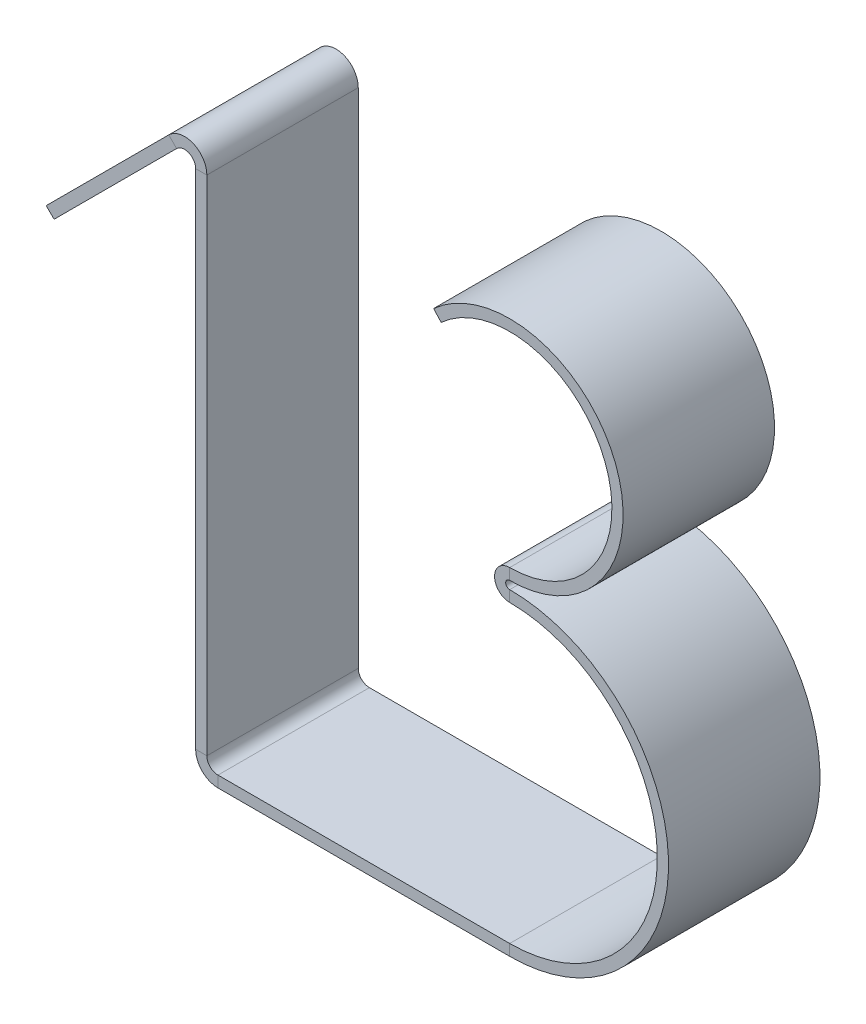
ISO-10303-21;
HEADER;
FILE_DESCRIPTION(('STEP AP214'),'2;1');
FILE_NAME('part.step','',(''),(''),'','','');
FILE_SCHEMA(('AUTOMOTIVE_DESIGN { 1 0 10303 214 1 1 1 1 }'));
ENDSEC;
DATA;
#1=APPLICATION_CONTEXT('core data for automotive mechanical design processes');
#2=APPLICATION_PROTOCOL_DEFINITION('international standard','automotive_design',2000,#1);
#3=PRODUCT_CONTEXT('',#1,'mechanical');
#4=PRODUCT('Part','Part','',(#3));
#5=PRODUCT_RELATED_PRODUCT_CATEGORY('part','',(#4));
#6=PRODUCT_DEFINITION_FORMATION('','',#4);
#7=PRODUCT_DEFINITION_CONTEXT('part definition',#1,'design');
#8=PRODUCT_DEFINITION('design','',#6,#7);
#9=PRODUCT_DEFINITION_SHAPE('','',#8);
#10=(LENGTH_UNIT() NAMED_UNIT(*) SI_UNIT(.MILLI.,.METRE.));
#11=(NAMED_UNIT(*) PLANE_ANGLE_UNIT() SI_UNIT($,.RADIAN.));
#12=(NAMED_UNIT(*) SI_UNIT($,.STERADIAN.) SOLID_ANGLE_UNIT());
#13=UNCERTAINTY_MEASURE_WITH_UNIT(LENGTH_MEASURE(1.E-05),#10,'distance_accuracy_value','');
#14=(GEOMETRIC_REPRESENTATION_CONTEXT(3) GLOBAL_UNCERTAINTY_ASSIGNED_CONTEXT((#13)) GLOBAL_UNIT_ASSIGNED_CONTEXT((#10,
#11,#12)) REPRESENTATION_CONTEXT('',''));
#15=CARTESIAN_POINT('',(0.,0.,0.));
#16=DIRECTION('',(0.,0.,1.));
#17=DIRECTION('',(1.,0.,0.));
#18=AXIS2_PLACEMENT_3D('',#15,#16,#17);
#19=CARTESIAN_POINT('',(20.,-0.7366,5.));
#20=DIRECTION('',(0.,0.,1.));
#21=DIRECTION('',(1.,0.,0.));
#22=AXIS2_PLACEMENT_3D('',#19,#20,#21);
#23=PLANE('',#22);
#24=DIRECTION('',(0.,1.,0.));
#25=VECTOR('',#24,1.);
#26=CARTESIAN_POINT('',(20.,-0.7366,5.));
#27=LINE('',#26,#25);
#28=CARTESIAN_POINT('',(20.,-0.7366,5.));
#29=VERTEX_POINT('',#28);
#30=CARTESIAN_POINT('',(20.,0.,5.));
#31=VERTEX_POINT('',#30);
#32=EDGE_CURVE('E11',#29,#31,#27,.T.);
#33=ORIENTED_EDGE('',*,*,#32,.F.);
#34=CARTESIAN_POINT('',(20.,9.74999999999999,5.));
#35=DIRECTION('',(0.,0.,1.));
#36=DIRECTION('',(1.,0.,0.));
#37=AXIS2_PLACEMENT_3D('',#34,#35,#36);
#38=CIRCLE('',#37,10.4866);
#39=CARTESIAN_POINT('',(20.,20.2366,5.));
#40=VERTEX_POINT('',#39);
#41=EDGE_CURVE('E173',#29,#40,#38,.T.);
#42=ORIENTED_EDGE('',*,*,#41,.T.);
#43=DIRECTION('',(0.,-1.,0.));
#44=VECTOR('',#43,1.);
#45=CARTESIAN_POINT('',(20.,20.2366,5.));
#46=LINE('',#45,#44);
#47=CARTESIAN_POINT('',(20.,19.5,5.));
#48=VERTEX_POINT('',#47);
#49=EDGE_CURVE('E318',#40,#48,#46,.T.);
#50=ORIENTED_EDGE('',*,*,#49,.T.);
#51=CARTESIAN_POINT('',(20.,9.74999999999999,5.));
#52=DIRECTION('',(0.,0.,1.));
#53=DIRECTION('',(1.,0.,0.));
#54=AXIS2_PLACEMENT_3D('',#51,#52,#53);
#55=CIRCLE('',#54,9.75);
#56=EDGE_CURVE('E176',#31,#48,#55,.T.);
#57=ORIENTED_EDGE('',*,*,#56,.F.);
#58=EDGE_LOOP('',(#33,#42,#50,#57));
#59=FACE_BOUND('',#58,.T.);
#60=ADVANCED_FACE('F38',(#59),#23,.T.);
#61=CARTESIAN_POINT('',(20.,0.,-5.));
#62=DIRECTION('',(0.,0.,-1.));
#63=DIRECTION('',(-1.,0.,0.));
#64=AXIS2_PLACEMENT_3D('',#61,#62,#63);
#65=PLANE('',#64);
#66=DIRECTION('',(0.,-1.,0.));
#67=VECTOR('',#66,1.);
#68=CARTESIAN_POINT('',(20.,0.,-5.));
#69=LINE('',#68,#67);
#70=CARTESIAN_POINT('',(20.,0.,-5.));
#71=VERTEX_POINT('',#70);
#72=CARTESIAN_POINT('',(20.,-0.7366,-4.99999999999999));
#73=VERTEX_POINT('',#72);
#74=EDGE_CURVE('E46',#71,#73,#69,.T.);
#75=ORIENTED_EDGE('',*,*,#74,.F.);
#76=CARTESIAN_POINT('',(20.,9.74999999999999,-5.));
#77=DIRECTION('',(0.,0.,1.));
#78=DIRECTION('',(1.,0.,0.));
#79=AXIS2_PLACEMENT_3D('',#76,#77,#78);
#80=CIRCLE('',#79,9.75);
#81=CARTESIAN_POINT('',(20.,19.5,-5.));
#82=VERTEX_POINT('',#81);
#83=EDGE_CURVE('E221',#71,#82,#80,.T.);
#84=ORIENTED_EDGE('',*,*,#83,.T.);
#85=DIRECTION('',(0.,1.,0.));
#86=VECTOR('',#85,1.);
#87=CARTESIAN_POINT('',(20.,19.5,-5.));
#88=LINE('',#87,#86);
#89=CARTESIAN_POINT('',(20.,20.2366,-5.));
#90=VERTEX_POINT('',#89);
#91=EDGE_CURVE('E113',#82,#90,#88,.T.);
#92=ORIENTED_EDGE('',*,*,#91,.T.);
#93=CARTESIAN_POINT('',(20.,9.74999999999999,-5.));
#94=DIRECTION('',(0.,0.,1.));
#95=DIRECTION('',(1.,0.,0.));
#96=AXIS2_PLACEMENT_3D('',#93,#94,#95);
#97=CIRCLE('',#96,10.4866);
#98=EDGE_CURVE('E254',#73,#90,#97,.T.);
#99=ORIENTED_EDGE('',*,*,#98,.F.);
#100=EDGE_LOOP('',(#75,#84,#92,#99));
#101=FACE_BOUND('',#100,.T.);
#102=ADVANCED_FACE('F322',(#101),#65,.T.);
#103=CARTESIAN_POINT('',(20.,20.2366,5.));
#104=DIRECTION('',(0.,0.,1.));
#105=DIRECTION('',(1.,0.,0.));
#106=AXIS2_PLACEMENT_3D('',#103,#104,#105);
#107=PLANE('',#106);
#108=ORIENTED_EDGE('',*,*,#49,.F.);
#109=CARTESIAN_POINT('',(20.,20.5,5.));
#110=DIRECTION('',(0.,0.,1.));
#111=DIRECTION('',(1.,0.,0.));
#112=AXIS2_PLACEMENT_3D('',#109,#110,#111);
#113=CIRCLE('',#112,0.263399999999999);
#114=CARTESIAN_POINT('',(20.,20.7634,5.));
#115=VERTEX_POINT('',#114);
#116=EDGE_CURVE('E204',#40,#115,#113,.F.);
#117=ORIENTED_EDGE('',*,*,#116,.T.);
#118=DIRECTION('',(0.,1.,0.));
#119=VECTOR('',#118,1.);
#120=CARTESIAN_POINT('',(20.,20.7634,5.));
#121=LINE('',#120,#119);
#122=CARTESIAN_POINT('',(20.,21.5,5.));
#123=VERTEX_POINT('',#122);
#124=EDGE_CURVE('E54',#115,#123,#121,.T.);
#125=ORIENTED_EDGE('',*,*,#124,.T.);
#126=CARTESIAN_POINT('',(20.,20.5,5.));
#127=DIRECTION('',(0.,0.,-1.));
#128=DIRECTION('',(-1.,0.,0.));
#129=AXIS2_PLACEMENT_3D('',#126,#127,#128);
#130=CIRCLE('',#129,0.999999999999999);
#131=EDGE_CURVE('E355',#48,#123,#130,.T.);
#132=ORIENTED_EDGE('',*,*,#131,.F.);
#133=EDGE_LOOP('',(#108,#117,#125,#132));
#134=FACE_BOUND('',#133,.T.);
#135=ADVANCED_FACE('F456',(#134),#107,.T.);
#136=CARTESIAN_POINT('',(20.,19.5,-5.));
#137=DIRECTION('',(0.,0.,-1.));
#138=DIRECTION('',(-1.,0.,0.));
#139=AXIS2_PLACEMENT_3D('',#136,#137,#138);
#140=PLANE('',#139);
#141=ORIENTED_EDGE('',*,*,#91,.F.);
#142=CARTESIAN_POINT('',(20.,20.5,-5.));
#143=DIRECTION('',(0.,0.,-1.));
#144=DIRECTION('',(-1.,0.,0.));
#145=AXIS2_PLACEMENT_3D('',#142,#143,#144);
#146=CIRCLE('',#145,0.999999999999999);
#147=CARTESIAN_POINT('',(20.,21.5,-5.));
#148=VERTEX_POINT('',#147);
#149=EDGE_CURVE('E219',#82,#148,#146,.T.);
#150=ORIENTED_EDGE('',*,*,#149,.T.);
#151=DIRECTION('',(0.,-1.,0.));
#152=VECTOR('',#151,1.);
#153=CARTESIAN_POINT('',(20.,21.5,-5.));
#154=LINE('',#153,#152);
#155=CARTESIAN_POINT('',(20.,20.7634,-5.));
#156=VERTEX_POINT('',#155);
#157=EDGE_CURVE('E120',#148,#156,#154,.T.);
#158=ORIENTED_EDGE('',*,*,#157,.T.);
#159=CARTESIAN_POINT('',(20.,20.5,-5.));
#160=DIRECTION('',(0.,0.,1.));
#161=DIRECTION('',(1.,0.,0.));
#162=AXIS2_PLACEMENT_3D('',#159,#160,#161);
#163=CIRCLE('',#162,0.263399999999999);
#164=EDGE_CURVE('E256',#90,#156,#163,.F.);
#165=ORIENTED_EDGE('',*,*,#164,.F.);
#166=EDGE_LOOP('',(#141,#150,#158,#165));
#167=FACE_BOUND('',#166,.T.);
#168=ADVANCED_FACE('F338',(#167),#140,.T.);
#169=CARTESIAN_POINT('',(20.,20.7634,5.));
#170=DIRECTION('',(0.,0.,1.));
#171=DIRECTION('',(1.,0.,0.));
#172=AXIS2_PLACEMENT_3D('',#169,#170,#171);
#173=PLANE('',#172);
#174=ORIENTED_EDGE('',*,*,#124,.F.);
#175=CARTESIAN_POINT('',(20.,28.25,5.));
#176=DIRECTION('',(0.,0.,1.));
#177=DIRECTION('',(1.,0.,0.));
#178=AXIS2_PLACEMENT_3D('',#175,#176,#177);
#179=CIRCLE('',#178,7.4866);
#180=CARTESIAN_POINT('',(14.9773371098646,33.8017598157752,5.));
#181=VERTEX_POINT('',#180);
#182=EDGE_CURVE('E126',#115,#181,#179,.T.);
#183=ORIENTED_EDGE('',*,*,#182,.T.);
#184=DIRECTION('',(-0.670887036857243,0.741559561853873,0.));
#185=VECTOR('',#184,1.);
#186=CARTESIAN_POINT('',(15.4715125012136,33.2555270425136,5.));
#187=LINE('',#186,#185);
#188=CARTESIAN_POINT('',(15.4715125012136,33.2555270425136,5.));
#189=VERTEX_POINT('',#188);
#190=EDGE_CURVE('E351',#189,#181,#187,.T.);
#191=ORIENTED_EDGE('',*,*,#190,.F.);
#192=CARTESIAN_POINT('',(20.,28.25,5.));
#193=DIRECTION('',(0.,0.,1.));
#194=DIRECTION('',(1.,0.,0.));
#195=AXIS2_PLACEMENT_3D('',#192,#193,#194);
#196=CIRCLE('',#195,6.75);
#197=EDGE_CURVE('E353',#123,#189,#196,.T.);
#198=ORIENTED_EDGE('',*,*,#197,.F.);
#199=EDGE_LOOP('',(#174,#183,#191,#198));
#200=FACE_BOUND('',#199,.T.);
#201=ADVANCED_FACE('F465',(#200),#173,.T.);
#202=CARTESIAN_POINT('',(20.,21.5,-5.));
#203=DIRECTION('',(0.,0.,-1.));
#204=DIRECTION('',(-1.,0.,0.));
#205=AXIS2_PLACEMENT_3D('',#202,#203,#204);
#206=PLANE('',#205);
#207=ORIENTED_EDGE('',*,*,#157,.F.);
#208=CARTESIAN_POINT('',(20.,28.25,-5.));
#209=DIRECTION('',(0.,0.,1.));
#210=DIRECTION('',(1.,0.,0.));
#211=AXIS2_PLACEMENT_3D('',#208,#209,#210);
#212=CIRCLE('',#211,6.75);
#213=CARTESIAN_POINT('',(15.4715125012136,33.2555270425136,-5.));
#214=VERTEX_POINT('',#213);
#215=EDGE_CURVE('E216',#148,#214,#212,.T.);
#216=ORIENTED_EDGE('',*,*,#215,.T.);
#217=DIRECTION('',(-0.670887036857243,0.741559561853873,0.));
#218=VECTOR('',#217,1.);
#219=CARTESIAN_POINT('',(15.4715125012136,33.2555270425136,-5.));
#220=LINE('',#219,#218);
#221=CARTESIAN_POINT('',(14.9773371098646,33.8017598157752,-5.));
#222=VERTEX_POINT('',#221);
#223=EDGE_CURVE('E213',#214,#222,#220,.T.);
#224=ORIENTED_EDGE('',*,*,#223,.T.);
#225=CARTESIAN_POINT('',(20.,28.25,-5.));
#226=DIRECTION('',(0.,0.,1.));
#227=DIRECTION('',(1.,0.,0.));
#228=AXIS2_PLACEMENT_3D('',#225,#226,#227);
#229=CIRCLE('',#228,7.4866);
#230=EDGE_CURVE('E210',#156,#222,#229,.T.);
#231=ORIENTED_EDGE('',*,*,#230,.F.);
#232=EDGE_LOOP('',(#207,#216,#224,#231));
#233=FACE_BOUND('',#232,.T.);
#234=ADVANCED_FACE('F346',(#233),#206,.T.);
#235=CARTESIAN_POINT('',(0.,33.9433805799119,5.));
#236=DIRECTION('',(0.,0.,1.));
#237=DIRECTION('',(1.,0.,0.));
#238=AXIS2_PLACEMENT_3D('',#235,#236,#237);
#239=PLANE('',#238);
#240=DIRECTION('',(-1.,0.,0.));
#241=VECTOR('',#240,1.);
#242=CARTESIAN_POINT('',(0.,33.9433805799119,5.));
#243=LINE('',#242,#241);
#244=CARTESIAN_POINT('',(0.,33.9433805799119,5.));
#245=VERTEX_POINT('',#244);
#246=CARTESIAN_POINT('',(-0.73659999999999,33.9433805799119,5.));
#247=VERTEX_POINT('',#246);
#248=EDGE_CURVE('E313',#245,#247,#243,.T.);
#249=ORIENTED_EDGE('',*,*,#248,.F.);
#250=CARTESIAN_POINT('',(-1.4732,33.9433805799119,5.));
#251=DIRECTION('',(0.,0.,1.));
#252=DIRECTION('',(1.,0.,0.));
#253=AXIS2_PLACEMENT_3D('',#250,#251,#252);
#254=CIRCLE('',#253,1.4732);
#255=CARTESIAN_POINT('',(-2.51490971004402,34.9850902899559,5.));
#256=VERTEX_POINT('',#255);
#257=EDGE_CURVE('E368',#256,#245,#254,.F.);
#258=ORIENTED_EDGE('',*,*,#257,.F.);
#259=DIRECTION('',(-0.707106781186551,0.707106781186544,0.));
#260=VECTOR('',#259,1.);
#261=CARTESIAN_POINT('',(-1.99405485502201,34.4642354349339,5.));
#262=LINE('',#261,#260);
#263=CARTESIAN_POINT('',(-1.99405485502201,34.4642354349339,5.));
#264=VERTEX_POINT('',#263);
#265=EDGE_CURVE('E311',#264,#256,#262,.T.);
#266=ORIENTED_EDGE('',*,*,#265,.F.);
#267=CARTESIAN_POINT('',(-1.4732,33.9433805799119,5.));
#268=DIRECTION('',(0.,0.,1.));
#269=DIRECTION('',(1.,0.,0.));
#270=AXIS2_PLACEMENT_3D('',#267,#268,#269);
#271=CIRCLE('',#270,0.7366);
#272=EDGE_CURVE('E380',#264,#247,#271,.F.);
#273=ORIENTED_EDGE('',*,*,#272,.T.);
#274=EDGE_LOOP('',(#249,#258,#266,#273));
#275=FACE_BOUND('',#274,.T.);
#276=ADVANCED_FACE('F413',(#275),#239,.T.);
#277=CARTESIAN_POINT('',(-1.99405485502201,34.4642354349339,5.));
#278=DIRECTION('',(0.,0.,1.));
#279=DIRECTION('',(1.,0.,0.));
#280=AXIS2_PLACEMENT_3D('',#277,#278,#279);
#281=PLANE('',#280);
#282=DIRECTION('',(0.,-1.,0.));
#283=VECTOR('',#282,1.);
#284=CARTESIAN_POINT('',(0.,37.5,5.));
#285=LINE('',#284,#283);
#286=CARTESIAN_POINT('',(0.,0.736599999999997,5.));
#287=VERTEX_POINT('',#286);
#288=EDGE_CURVE('E365',#245,#287,#285,.T.);
#289=ORIENTED_EDGE('',*,*,#288,.F.);
#290=ORIENTED_EDGE('',*,*,#248,.T.);
#291=DIRECTION('',(0.,-1.,0.));
#292=VECTOR('',#291,1.);
#293=CARTESIAN_POINT('',(-0.73659999999999,37.5,5.));
#294=LINE('',#293,#292);
#295=CARTESIAN_POINT('',(-0.736599999999997,0.736599999999996,5.));
#296=VERTEX_POINT('',#295);
#297=EDGE_CURVE('E383',#247,#296,#294,.T.);
#298=ORIENTED_EDGE('',*,*,#297,.T.);
#299=DIRECTION('',(1.,0.,0.));
#300=VECTOR('',#299,1.);
#301=CARTESIAN_POINT('',(-0.736599999999997,0.736599999999996,5.));
#302=LINE('',#301,#300);
#303=EDGE_CURVE('E304',#296,#287,#302,.T.);
#304=ORIENTED_EDGE('',*,*,#303,.T.);
#305=EDGE_LOOP('',(#289,#290,#298,#304));
#306=FACE_BOUND('',#305,.T.);
#307=ADVANCED_FACE('F406',(#306),#281,.T.);
#308=CARTESIAN_POINT('',(-2.51490971004401,34.9850902899559,-4.99999999999998));
#309=DIRECTION('',(0.,0.,-1.));
#310=DIRECTION('',(-1.,0.,0.));
#311=AXIS2_PLACEMENT_3D('',#308,#309,#310);
#312=PLANE('',#311);
#313=DIRECTION('',(0.707106781186551,-0.707106781186544,0.));
#314=VECTOR('',#313,1.);
#315=CARTESIAN_POINT('',(-2.51490971004401,34.9850902899559,-4.99999999999998));
#316=LINE('',#315,#314);
#317=CARTESIAN_POINT('',(-2.51490971004401,34.9850902899559,-4.99999999999998));
#318=VERTEX_POINT('',#317);
#319=CARTESIAN_POINT('',(-1.99405485502201,34.4642354349339,-4.99999999999999));
#320=VERTEX_POINT('',#319);
#321=EDGE_CURVE('E309',#318,#320,#316,.T.);
#322=ORIENTED_EDGE('',*,*,#321,.F.);
#323=CARTESIAN_POINT('',(-1.4732,33.9433805799119,-5.));
#324=DIRECTION('',(0.,0.,1.));
#325=DIRECTION('',(1.,0.,0.));
#326=AXIS2_PLACEMENT_3D('',#323,#324,#325);
#327=CIRCLE('',#326,1.4732);
#328=CARTESIAN_POINT('',(0.,33.9433805799119,-4.99999999999999));
#329=VERTEX_POINT('',#328);
#330=EDGE_CURVE('E232',#318,#329,#327,.F.);
#331=ORIENTED_EDGE('',*,*,#330,.T.);
#332=DIRECTION('',(1.,0.,0.));
#333=VECTOR('',#332,1.);
#334=CARTESIAN_POINT('',(-0.736599999999997,33.9433805799119,-5.));
#335=LINE('',#334,#333);
#336=CARTESIAN_POINT('',(-0.736599999999997,33.9433805799119,-5.));
#337=VERTEX_POINT('',#336);
#338=EDGE_CURVE('E307',#337,#329,#335,.T.);
#339=ORIENTED_EDGE('',*,*,#338,.F.);
#340=CARTESIAN_POINT('',(-1.4732,33.9433805799119,-5.));
#341=DIRECTION('',(0.,0.,1.));
#342=DIRECTION('',(1.,0.,0.));
#343=AXIS2_PLACEMENT_3D('',#340,#341,#342);
#344=CIRCLE('',#343,0.7366);
#345=EDGE_CURVE('E244',#320,#337,#344,.F.);
#346=ORIENTED_EDGE('',*,*,#345,.F.);
#347=EDGE_LOOP('',(#322,#331,#339,#346));
#348=FACE_BOUND('',#347,.T.);
#349=ADVANCED_FACE('F441',(#348),#312,.T.);
#350=CARTESIAN_POINT('',(-0.736599999999997,33.9433805799119,-5.));
#351=DIRECTION('',(0.,0.,-1.));
#352=DIRECTION('',(-1.,0.,0.));
#353=AXIS2_PLACEMENT_3D('',#350,#351,#352);
#354=PLANE('',#353);
#355=DIRECTION('',(0.707106781186543,0.707106781186552,0.));
#356=VECTOR('',#355,1.);
#357=CARTESIAN_POINT('',(-10.6066017177981,26.8933982822017,-4.99999999999999));
#358=LINE('',#357,#356);
#359=CARTESIAN_POINT('',(-10.6066017177981,26.8933982822017,-4.99999999999999));
#360=VERTEX_POINT('',#359);
#361=EDGE_CURVE('E235',#360,#318,#358,.T.);
#362=ORIENTED_EDGE('',*,*,#361,.T.);
#363=ORIENTED_EDGE('',*,*,#321,.T.);
#364=DIRECTION('',(0.707106781186543,0.707106781186552,0.));
#365=VECTOR('',#364,1.);
#366=CARTESIAN_POINT('',(-10.0857468627761,26.3725434271797,-5.));
#367=LINE('',#366,#365);
#368=CARTESIAN_POINT('',(-10.0857468627761,26.3725434271797,-5.));
#369=VERTEX_POINT('',#368);
#370=EDGE_CURVE('E241',#369,#320,#367,.T.);
#371=ORIENTED_EDGE('',*,*,#370,.F.);
#372=DIRECTION('',(-0.707106781186551,0.707106781186544,0.));
#373=VECTOR('',#372,1.);
#374=CARTESIAN_POINT('',(-10.0857468627761,26.3725434271797,-5.));
#375=LINE('',#374,#373);
#376=EDGE_CURVE('E238',#369,#360,#375,.T.);
#377=ORIENTED_EDGE('',*,*,#376,.T.);
#378=EDGE_LOOP('',(#362,#363,#371,#377));
#379=FACE_BOUND('',#378,.T.);
#380=ADVANCED_FACE('F443',(#379),#354,.T.);
#381=CARTESIAN_POINT('',(0.73659999999999,0.,5.));
#382=DIRECTION('',(0.,0.,1.));
#383=DIRECTION('',(1.,0.,0.));
#384=AXIS2_PLACEMENT_3D('',#381,#382,#383);
#385=PLANE('',#384);
#386=DIRECTION('',(0.,-1.,0.));
#387=VECTOR('',#386,1.);
#388=CARTESIAN_POINT('',(0.73659999999999,0.,5.));
#389=LINE('',#388,#387);
#390=CARTESIAN_POINT('',(0.73659999999999,0.,5.));
#391=VERTEX_POINT('',#390);
#392=CARTESIAN_POINT('',(0.73659999999999,-0.7366,5.));
#393=VERTEX_POINT('',#392);
#394=EDGE_CURVE('E185',#391,#393,#389,.T.);
#395=ORIENTED_EDGE('',*,*,#394,.F.);
#396=CARTESIAN_POINT('',(0.73659999999999,0.736599999999998,5.));
#397=DIRECTION('',(0.,0.,-1.));
#398=DIRECTION('',(-1.,0.,0.));
#399=AXIS2_PLACEMENT_3D('',#396,#397,#398);
#400=CIRCLE('',#399,0.7366);
#401=EDGE_CURVE('E362',#287,#391,#400,.F.);
#402=ORIENTED_EDGE('',*,*,#401,.F.);
#403=ORIENTED_EDGE('',*,*,#303,.F.);
#404=CARTESIAN_POINT('',(0.73659999999999,0.736599999999998,5.));
#405=DIRECTION('',(0.,0.,1.));
#406=DIRECTION('',(1.,0.,0.));
#407=AXIS2_PLACEMENT_3D('',#404,#405,#406);
#408=CIRCLE('',#407,1.4732);
#409=EDGE_CURVE('E189',#296,#393,#408,.T.);
#410=ORIENTED_EDGE('',*,*,#409,.T.);
#411=EDGE_LOOP('',(#395,#402,#403,#410));
#412=FACE_BOUND('',#411,.T.);
#413=ADVANCED_FACE('F388',(#412),#385,.T.);
#414=CARTESIAN_POINT('',(-0.736599999999997,0.736599999999996,5.));
#415=DIRECTION('',(0.,0.,1.));
#416=DIRECTION('',(1.,0.,0.));
#417=AXIS2_PLACEMENT_3D('',#414,#415,#416);
#418=PLANE('',#417);
#419=DIRECTION('',(1.,0.,0.));
#420=VECTOR('',#419,1.);
#421=CARTESIAN_POINT('',(0.,0.,5.));
#422=LINE('',#421,#420);
#423=EDGE_CURVE('E327',#391,#31,#422,.T.);
#424=ORIENTED_EDGE('',*,*,#423,.F.);
#425=ORIENTED_EDGE('',*,*,#394,.T.);
#426=DIRECTION('',(1.,0.,0.));
#427=VECTOR('',#426,1.);
#428=CARTESIAN_POINT('',(0.,-0.7366,5.));
#429=LINE('',#428,#427);
#430=EDGE_CURVE('E182',#393,#29,#429,.T.);
#431=ORIENTED_EDGE('',*,*,#430,.T.);
#432=ORIENTED_EDGE('',*,*,#32,.T.);
#433=EDGE_LOOP('',(#424,#425,#431,#432));
#434=FACE_BOUND('',#433,.T.);
#435=ADVANCED_FACE('F184',(#434),#418,.T.);
#436=CARTESIAN_POINT('',(0.,0.736599999999997,-5.));
#437=DIRECTION('',(0.,0.,-1.));
#438=DIRECTION('',(-1.,0.,0.));
#439=AXIS2_PLACEMENT_3D('',#436,#437,#438);
#440=PLANE('',#439);
#441=DIRECTION('',(-1.,0.,0.));
#442=VECTOR('',#441,1.);
#443=CARTESIAN_POINT('',(0.,0.736599999999997,-5.));
#444=LINE('',#443,#442);
#445=CARTESIAN_POINT('',(0.,0.736599999999997,-5.));
#446=VERTEX_POINT('',#445);
#447=CARTESIAN_POINT('',(-0.736599999999997,0.736599999999996,-5.));
#448=VERTEX_POINT('',#447);
#449=EDGE_CURVE('E302',#446,#448,#444,.T.);
#450=ORIENTED_EDGE('',*,*,#449,.F.);
#451=CARTESIAN_POINT('',(0.736600000000004,0.736599999999999,-4.99999999999999));
#452=DIRECTION('',(0.,0.,-1.));
#453=DIRECTION('',(-1.,0.,0.));
#454=AXIS2_PLACEMENT_3D('',#451,#452,#453);
#455=CIRCLE('',#454,0.7366);
#456=CARTESIAN_POINT('',(0.736600000000004,0.,-4.99999999999999));
#457=VERTEX_POINT('',#456);
#458=EDGE_CURVE('E226',#446,#457,#455,.F.);
#459=ORIENTED_EDGE('',*,*,#458,.T.);
#460=DIRECTION('',(0.,1.,0.));
#461=VECTOR('',#460,1.);
#462=CARTESIAN_POINT('',(0.736600000000004,-0.7366,-4.99999999999999));
#463=LINE('',#462,#461);
#464=CARTESIAN_POINT('',(0.736600000000004,-0.7366,-4.99999999999999));
#465=VERTEX_POINT('',#464);
#466=EDGE_CURVE('E300',#465,#457,#463,.T.);
#467=ORIENTED_EDGE('',*,*,#466,.F.);
#468=CARTESIAN_POINT('',(0.736600000000004,0.736599999999999,-4.99999999999999));
#469=DIRECTION('',(0.,0.,1.));
#470=DIRECTION('',(1.,0.,0.));
#471=AXIS2_PLACEMENT_3D('',#468,#469,#470);
#472=CIRCLE('',#471,1.4732);
#473=EDGE_CURVE('E250',#448,#465,#472,.T.);
#474=ORIENTED_EDGE('',*,*,#473,.F.);
#475=EDGE_LOOP('',(#450,#459,#467,#474));
#476=FACE_BOUND('',#475,.T.);
#477=ADVANCED_FACE('F395',(#476),#440,.T.);
#478=CARTESIAN_POINT('',(0.736600000000004,-0.7366,-4.99999999999999));
#479=DIRECTION('',(0.,0.,-1.));
#480=DIRECTION('',(-1.,0.,0.));
#481=AXIS2_PLACEMENT_3D('',#478,#479,#480);
#482=PLANE('',#481);
#483=DIRECTION('',(0.,-1.,0.));
#484=VECTOR('',#483,1.);
#485=CARTESIAN_POINT('',(0.,37.5,-4.99999999999999));
#486=LINE('',#485,#484);
#487=EDGE_CURVE('E229',#329,#446,#486,.T.);
#488=ORIENTED_EDGE('',*,*,#487,.T.);
#489=ORIENTED_EDGE('',*,*,#449,.T.);
#490=DIRECTION('',(0.,-1.,0.));
#491=VECTOR('',#490,1.);
#492=CARTESIAN_POINT('',(-0.736599999999997,37.5,-5.));
#493=LINE('',#492,#491);
#494=EDGE_CURVE('E247',#337,#448,#493,.T.);
#495=ORIENTED_EDGE('',*,*,#494,.F.);
#496=ORIENTED_EDGE('',*,*,#338,.T.);
#497=EDGE_LOOP('',(#488,#489,#495,#496));
#498=FACE_BOUND('',#497,.T.);
#499=ADVANCED_FACE('F439',(#498),#482,.T.);
#500=CARTESIAN_POINT('',(20.,28.25,5.));
#501=DIRECTION('',(0.,0.,-1.));
#502=DIRECTION('',(-1.,0.,0.));
#503=AXIS2_PLACEMENT_3D('',#500,#501,#502);
#504=CYLINDRICAL_SURFACE('',#503,7.4866);
#505=ORIENTED_EDGE('',*,*,#230,.T.);
#506=DIRECTION('',(0.,0.,-1.));
#507=VECTOR('',#506,1.);
#508=CARTESIAN_POINT('',(14.9773371098646,33.8017598157752,5.));
#509=LINE('',#508,#507);
#510=EDGE_CURVE('E298',#181,#222,#509,.T.);
#511=ORIENTED_EDGE('',*,*,#510,.F.);
#512=ORIENTED_EDGE('',*,*,#182,.F.);
#513=DIRECTION('',(0.,0.,-1.));
#514=VECTOR('',#513,1.);
#515=CARTESIAN_POINT('',(20.,20.7634,5.));
#516=LINE('',#515,#514);
#517=EDGE_CURVE('E206',#115,#156,#516,.T.);
#518=ORIENTED_EDGE('',*,*,#517,.T.);
#519=EDGE_LOOP('',(#505,#511,#512,#518));
#520=FACE_BOUND('',#519,.T.);
#521=ADVANCED_FACE('F344',(#520),#504,.T.);
#522=CARTESIAN_POINT('',(15.4715125012136,33.2555270425136,5.));
#523=DIRECTION('',(-0.741559561853873,-0.670887036857243,0.));
#524=DIRECTION('',(0.670887036857243,-0.741559561853873,0.));
#525=AXIS2_PLACEMENT_3D('',#522,#523,#524);
#526=PLANE('',#525);
#527=ORIENTED_EDGE('',*,*,#223,.F.);
#528=DIRECTION('',(0.,0.,-1.));
#529=VECTOR('',#528,1.);
#530=CARTESIAN_POINT('',(15.4715125012136,33.2555270425136,5.));
#531=LINE('',#530,#529);
#532=EDGE_CURVE('E296',#189,#214,#531,.T.);
#533=ORIENTED_EDGE('',*,*,#532,.F.);
#534=ORIENTED_EDGE('',*,*,#190,.T.);
#535=ORIENTED_EDGE('',*,*,#510,.T.);
#536=EDGE_LOOP('',(#527,#533,#534,#535));
#537=FACE_BOUND('',#536,.T.);
#538=ADVANCED_FACE('F349',(#537),#526,.T.);
#539=CARTESIAN_POINT('',(20.,28.25,5.));
#540=DIRECTION('',(0.,0.,-1.));
#541=DIRECTION('',(-1.,0.,0.));
#542=AXIS2_PLACEMENT_3D('',#539,#540,#541);
#543=CYLINDRICAL_SURFACE('',#542,6.75);
#544=ORIENTED_EDGE('',*,*,#215,.F.);
#545=DIRECTION('',(0.,0.,-1.));
#546=VECTOR('',#545,1.);
#547=CARTESIAN_POINT('',(20.,21.5,5.));
#548=LINE('',#547,#546);
#549=EDGE_CURVE('E293',#123,#148,#548,.T.);
#550=ORIENTED_EDGE('',*,*,#549,.F.);
#551=ORIENTED_EDGE('',*,*,#197,.T.);
#552=ORIENTED_EDGE('',*,*,#532,.T.);
#553=EDGE_LOOP('',(#544,#550,#551,#552));
#554=FACE_BOUND('',#553,.T.);
#555=ADVANCED_FACE('F539',(#554),#543,.F.);
#556=CARTESIAN_POINT('',(20.,20.5,5.));
#557=DIRECTION('',(0.,0.,-1.));
#558=DIRECTION('',(-1.,0.,0.));
#559=AXIS2_PLACEMENT_3D('',#556,#557,#558);
#560=CYLINDRICAL_SURFACE('',#559,0.999999999999999);
#561=ORIENTED_EDGE('',*,*,#149,.F.);
#562=DIRECTION('',(0.,0.,-1.));
#563=VECTOR('',#562,1.);
#564=CARTESIAN_POINT('',(20.,19.5,5.));
#565=LINE('',#564,#563);
#566=EDGE_CURVE('E290',#48,#82,#565,.T.);
#567=ORIENTED_EDGE('',*,*,#566,.F.);
#568=ORIENTED_EDGE('',*,*,#131,.T.);
#569=ORIENTED_EDGE('',*,*,#549,.T.);
#570=EDGE_LOOP('',(#561,#567,#568,#569));
#571=FACE_BOUND('',#570,.T.);
#572=ADVANCED_FACE('F335',(#571),#560,.T.);
#573=CARTESIAN_POINT('',(20.,9.74999999999999,5.));
#574=DIRECTION('',(0.,0.,-1.));
#575=DIRECTION('',(-1.,0.,0.));
#576=AXIS2_PLACEMENT_3D('',#573,#574,#575);
#577=CYLINDRICAL_SURFACE('',#576,9.75);
#578=ORIENTED_EDGE('',*,*,#83,.F.);
#579=DIRECTION('',(0.,0.,-1.));
#580=VECTOR('',#579,1.);
#581=CARTESIAN_POINT('',(20.,0.,5.));
#582=LINE('',#581,#580);
#583=EDGE_CURVE('E287',#31,#71,#582,.T.);
#584=ORIENTED_EDGE('',*,*,#583,.F.);
#585=ORIENTED_EDGE('',*,*,#56,.T.);
#586=ORIENTED_EDGE('',*,*,#566,.T.);
#587=EDGE_LOOP('',(#578,#584,#585,#586));
#588=FACE_BOUND('',#587,.T.);
#589=ADVANCED_FACE('F329',(#588),#577,.F.);
#590=CARTESIAN_POINT('',(0.,0.,5.));
#591=DIRECTION('',(0.,1.,0.));
#592=DIRECTION('',(0.,0.,1.));
#593=AXIS2_PLACEMENT_3D('',#590,#591,#592);
#594=PLANE('',#593);
#595=DIRECTION('',(1.,0.,0.));
#596=VECTOR('',#595,1.);
#597=CARTESIAN_POINT('',(0.,0.,-5.));
#598=LINE('',#597,#596);
#599=EDGE_CURVE('E223',#457,#71,#598,.T.);
#600=ORIENTED_EDGE('',*,*,#599,.F.);
#601=DIRECTION('',(0.,0.,-1.));
#602=VECTOR('',#601,1.);
#603=CARTESIAN_POINT('',(0.73659999999999,0.,5.));
#604=LINE('',#603,#602);
#605=EDGE_CURVE('E284',#391,#457,#604,.T.);
#606=ORIENTED_EDGE('',*,*,#605,.F.);
#607=ORIENTED_EDGE('',*,*,#423,.T.);
#608=ORIENTED_EDGE('',*,*,#583,.T.);
#609=EDGE_LOOP('',(#600,#606,#607,#608));
#610=FACE_BOUND('',#609,.T.);
#611=ADVANCED_FACE('F325',(#610),#594,.T.);
#612=CARTESIAN_POINT('',(0.73659999999999,0.736599999999998,5.));
#613=DIRECTION('',(0.,0.,-1.));
#614=DIRECTION('',(-1.,0.,0.));
#615=AXIS2_PLACEMENT_3D('',#612,#613,#614);
#616=CYLINDRICAL_SURFACE('',#615,0.7366);
#617=ORIENTED_EDGE('',*,*,#458,.F.);
#618=DIRECTION('',(0.,0.,-1.));
#619=VECTOR('',#618,1.);
#620=CARTESIAN_POINT('',(0.,0.736599999999997,5.));
#621=LINE('',#620,#619);
#622=EDGE_CURVE('E281',#287,#446,#621,.T.);
#623=ORIENTED_EDGE('',*,*,#622,.F.);
#624=ORIENTED_EDGE('',*,*,#401,.T.);
#625=ORIENTED_EDGE('',*,*,#605,.T.);
#626=EDGE_LOOP('',(#617,#623,#624,#625));
#627=FACE_BOUND('',#626,.T.);
#628=ADVANCED_FACE('F398',(#627),#616,.F.);
#629=CARTESIAN_POINT('',(0.,37.5,5.));
#630=DIRECTION('',(1.,0.,0.));
#631=DIRECTION('',(0.,1.,0.));
#632=AXIS2_PLACEMENT_3D('',#629,#630,#631);
#633=PLANE('',#632);
#634=ORIENTED_EDGE('',*,*,#487,.F.);
#635=DIRECTION('',(0.,0.,-1.));
#636=VECTOR('',#635,1.);
#637=CARTESIAN_POINT('',(0.,33.9433805799119,5.));
#638=LINE('',#637,#636);
#639=EDGE_CURVE('E278',#245,#329,#638,.T.);
#640=ORIENTED_EDGE('',*,*,#639,.F.);
#641=ORIENTED_EDGE('',*,*,#288,.T.);
#642=ORIENTED_EDGE('',*,*,#622,.T.);
#643=EDGE_LOOP('',(#634,#640,#641,#642));
#644=FACE_BOUND('',#643,.T.);
#645=ADVANCED_FACE('F404',(#644),#633,.T.);
#646=CARTESIAN_POINT('',(-1.4732,33.9433805799119,5.));
#647=DIRECTION('',(0.,0.,-1.));
#648=DIRECTION('',(-1.,0.,0.));
#649=AXIS2_PLACEMENT_3D('',#646,#647,#648);
#650=CYLINDRICAL_SURFACE('',#649,1.4732);
#651=ORIENTED_EDGE('',*,*,#330,.F.);
#652=DIRECTION('',(0.,0.,-1.));
#653=VECTOR('',#652,1.);
#654=CARTESIAN_POINT('',(-2.51490971004402,34.9850902899559,5.));
#655=LINE('',#654,#653);
#656=EDGE_CURVE('E275',#256,#318,#655,.T.);
#657=ORIENTED_EDGE('',*,*,#656,.F.);
#658=ORIENTED_EDGE('',*,*,#257,.T.);
#659=ORIENTED_EDGE('',*,*,#639,.T.);
#660=EDGE_LOOP('',(#651,#657,#658,#659));
#661=FACE_BOUND('',#660,.T.);
#662=ADVANCED_FACE('F411',(#661),#650,.T.);
#663=CARTESIAN_POINT('',(-10.6066017177981,26.8933982822017,5.));
#664=DIRECTION('',(-0.707106781186552,0.707106781186543,0.));
#665=DIRECTION('',(-0.707106781186543,-0.707106781186552,0.));
#666=AXIS2_PLACEMENT_3D('',#663,#664,#665);
#667=PLANE('',#666);
#668=ORIENTED_EDGE('',*,*,#361,.F.);
#669=DIRECTION('',(0.,0.,-1.));
#670=VECTOR('',#669,1.);
#671=CARTESIAN_POINT('',(-10.6066017177981,26.8933982822017,5.));
#672=LINE('',#671,#670);
#673=CARTESIAN_POINT('',(-10.6066017177981,26.8933982822017,5.));
#674=VERTEX_POINT('',#673);
#675=EDGE_CURVE('E273',#674,#360,#672,.T.);
#676=ORIENTED_EDGE('',*,*,#675,.F.);
#677=DIRECTION('',(0.707106781186543,0.707106781186552,0.));
#678=VECTOR('',#677,1.);
#679=CARTESIAN_POINT('',(-10.6066017177981,26.8933982822017,5.));
#680=LINE('',#679,#678);
#681=EDGE_CURVE('E371',#674,#256,#680,.T.);
#682=ORIENTED_EDGE('',*,*,#681,.T.);
#683=ORIENTED_EDGE('',*,*,#656,.T.);
#684=EDGE_LOOP('',(#668,#676,#682,#683));
#685=FACE_BOUND('',#684,.T.);
#686=ADVANCED_FACE('F417',(#685),#667,.T.);
#687=CARTESIAN_POINT('',(-10.0857468627761,26.3725434271797,5.));
#688=DIRECTION('',(-0.707106781186544,-0.707106781186551,0.));
#689=DIRECTION('',(0.707106781186551,-0.707106781186544,0.));
#690=AXIS2_PLACEMENT_3D('',#687,#688,#689);
#691=PLANE('',#690);
#692=ORIENTED_EDGE('',*,*,#376,.F.);
#693=DIRECTION('',(0.,0.,-1.));
#694=VECTOR('',#693,1.);
#695=CARTESIAN_POINT('',(-10.0857468627761,26.3725434271797,5.));
#696=LINE('',#695,#694);
#697=CARTESIAN_POINT('',(-10.0857468627761,26.3725434271797,5.));
#698=VERTEX_POINT('',#697);
#699=EDGE_CURVE('E271',#698,#369,#696,.T.);
#700=ORIENTED_EDGE('',*,*,#699,.F.);
#701=DIRECTION('',(-0.707106781186551,0.707106781186544,0.));
#702=VECTOR('',#701,1.);
#703=CARTESIAN_POINT('',(-10.0857468627761,26.3725434271797,5.));
#704=LINE('',#703,#702);
#705=EDGE_CURVE('E374',#698,#674,#704,.T.);
#706=ORIENTED_EDGE('',*,*,#705,.T.);
#707=ORIENTED_EDGE('',*,*,#675,.T.);
#708=EDGE_LOOP('',(#692,#700,#706,#707));
#709=FACE_BOUND('',#708,.T.);
#710=ADVANCED_FACE('F423',(#709),#691,.T.);
#711=CARTESIAN_POINT('',(-10.0857468627761,26.3725434271797,5.));
#712=DIRECTION('',(-0.707106781186552,0.707106781186543,0.));
#713=DIRECTION('',(-0.707106781186543,-0.707106781186552,0.));
#714=AXIS2_PLACEMENT_3D('',#711,#712,#713);
#715=PLANE('',#714);
#716=ORIENTED_EDGE('',*,*,#370,.T.);
#717=DIRECTION('',(0.,0.,-1.));
#718=VECTOR('',#717,1.);
#719=CARTESIAN_POINT('',(-1.99405485502201,34.4642354349339,5.));
#720=LINE('',#719,#718);
#721=EDGE_CURVE('E268',#264,#320,#720,.T.);
#722=ORIENTED_EDGE('',*,*,#721,.F.);
#723=DIRECTION('',(0.707106781186543,0.707106781186552,0.));
#724=VECTOR('',#723,1.);
#725=CARTESIAN_POINT('',(-10.0857468627761,26.3725434271797,5.));
#726=LINE('',#725,#724);
#727=EDGE_CURVE('E377',#698,#264,#726,.T.);
#728=ORIENTED_EDGE('',*,*,#727,.F.);
#729=ORIENTED_EDGE('',*,*,#699,.T.);
#730=EDGE_LOOP('',(#716,#722,#728,#729));
#731=FACE_BOUND('',#730,.T.);
#732=ADVANCED_FACE('F428',(#731),#715,.F.);
#733=CARTESIAN_POINT('',(-1.4732,33.9433805799119,5.));
#734=DIRECTION('',(0.,0.,-1.));
#735=DIRECTION('',(-1.,0.,0.));
#736=AXIS2_PLACEMENT_3D('',#733,#734,#735);
#737=CYLINDRICAL_SURFACE('',#736,0.7366);
#738=ORIENTED_EDGE('',*,*,#345,.T.);
#739=DIRECTION('',(0.,0.,-1.));
#740=VECTOR('',#739,1.);
#741=CARTESIAN_POINT('',(-0.73659999999999,33.9433805799119,5.));
#742=LINE('',#741,#740);
#743=EDGE_CURVE('E265',#247,#337,#742,.T.);
#744=ORIENTED_EDGE('',*,*,#743,.F.);
#745=ORIENTED_EDGE('',*,*,#272,.F.);
#746=ORIENTED_EDGE('',*,*,#721,.T.);
#747=EDGE_LOOP('',(#738,#744,#745,#746));
#748=FACE_BOUND('',#747,.T.);
#749=ADVANCED_FACE('F433',(#748),#737,.F.);
#750=CARTESIAN_POINT('',(-0.73659999999999,37.5,5.));
#751=DIRECTION('',(1.,0.,0.));
#752=DIRECTION('',(0.,1.,0.));
#753=AXIS2_PLACEMENT_3D('',#750,#751,#752);
#754=PLANE('',#753);
#755=ORIENTED_EDGE('',*,*,#494,.T.);
#756=DIRECTION('',(0.,0.,-1.));
#757=VECTOR('',#756,1.);
#758=CARTESIAN_POINT('',(-0.736599999999997,0.736599999999996,5.));
#759=LINE('',#758,#757);
#760=EDGE_CURVE('E262',#296,#448,#759,.T.);
#761=ORIENTED_EDGE('',*,*,#760,.F.);
#762=ORIENTED_EDGE('',*,*,#297,.F.);
#763=ORIENTED_EDGE('',*,*,#743,.T.);
#764=EDGE_LOOP('',(#755,#761,#762,#763));
#765=FACE_BOUND('',#764,.T.);
#766=ADVANCED_FACE('F437',(#765),#754,.F.);
#767=CARTESIAN_POINT('',(0.73659999999999,0.736599999999998,5.));
#768=DIRECTION('',(0.,0.,-1.));
#769=DIRECTION('',(-1.,0.,0.));
#770=AXIS2_PLACEMENT_3D('',#767,#768,#769);
#771=CYLINDRICAL_SURFACE('',#770,1.4732);
#772=ORIENTED_EDGE('',*,*,#473,.T.);
#773=DIRECTION('',(0.,0.,-1.));
#774=VECTOR('',#773,1.);
#775=CARTESIAN_POINT('',(0.73659999999999,-0.7366,5.));
#776=LINE('',#775,#774);
#777=EDGE_CURVE('E198',#393,#465,#776,.T.);
#778=ORIENTED_EDGE('',*,*,#777,.F.);
#779=ORIENTED_EDGE('',*,*,#409,.F.);
#780=ORIENTED_EDGE('',*,*,#760,.T.);
#781=EDGE_LOOP('',(#772,#778,#779,#780));
#782=FACE_BOUND('',#781,.T.);
#783=ADVANCED_FACE('F391',(#782),#771,.T.);
#784=CARTESIAN_POINT('',(0.,-0.7366,5.));
#785=DIRECTION('',(0.,1.,0.));
#786=DIRECTION('',(0.,0.,1.));
#787=AXIS2_PLACEMENT_3D('',#784,#785,#786);
#788=PLANE('',#787);
#789=DIRECTION('',(1.,0.,0.));
#790=VECTOR('',#789,1.);
#791=CARTESIAN_POINT('',(0.,-0.7366,-5.));
#792=LINE('',#791,#790);
#793=EDGE_CURVE('E196',#465,#73,#792,.T.);
#794=ORIENTED_EDGE('',*,*,#793,.T.);
#795=DIRECTION('',(0.,0.,-1.));
#796=VECTOR('',#795,1.);
#797=CARTESIAN_POINT('',(20.,-0.7366,5.));
#798=LINE('',#797,#796);
#799=EDGE_CURVE('E193',#29,#73,#798,.T.);
#800=ORIENTED_EDGE('',*,*,#799,.F.);
#801=ORIENTED_EDGE('',*,*,#430,.F.);
#802=ORIENTED_EDGE('',*,*,#777,.T.);
#803=EDGE_LOOP('',(#794,#800,#801,#802));
#804=FACE_BOUND('',#803,.T.);
#805=ADVANCED_FACE('F194',(#804),#788,.F.);
#806=CARTESIAN_POINT('',(20.,9.74999999999999,5.));
#807=DIRECTION('',(0.,0.,-1.));
#808=DIRECTION('',(-1.,0.,0.));
#809=AXIS2_PLACEMENT_3D('',#806,#807,#808);
#810=CYLINDRICAL_SURFACE('',#809,10.4866);
#811=ORIENTED_EDGE('',*,*,#98,.T.);
#812=DIRECTION('',(0.,0.,-1.));
#813=VECTOR('',#812,1.);
#814=CARTESIAN_POINT('',(20.,20.2366,5.));
#815=LINE('',#814,#813);
#816=EDGE_CURVE('E199',#40,#90,#815,.T.);
#817=ORIENTED_EDGE('',*,*,#816,.F.);
#818=ORIENTED_EDGE('',*,*,#41,.F.);
#819=ORIENTED_EDGE('',*,*,#799,.T.);
#820=EDGE_LOOP('',(#811,#817,#818,#819));
#821=FACE_BOUND('',#820,.T.);
#822=ADVANCED_FACE('F201',(#821),#810,.T.);
#823=CARTESIAN_POINT('',(20.,20.5,5.));
#824=DIRECTION('',(0.,0.,-1.));
#825=DIRECTION('',(-1.,0.,0.));
#826=AXIS2_PLACEMENT_3D('',#823,#824,#825);
#827=CYLINDRICAL_SURFACE('',#826,0.263399999999999);
#828=ORIENTED_EDGE('',*,*,#164,.T.);
#829=ORIENTED_EDGE('',*,*,#517,.F.);
#830=ORIENTED_EDGE('',*,*,#116,.F.);
#831=ORIENTED_EDGE('',*,*,#816,.T.);
#832=EDGE_LOOP('',(#828,#829,#830,#831));
#833=FACE_BOUND('',#832,.T.);
#834=ADVANCED_FACE('F341',(#833),#827,.F.);
#835=CARTESIAN_POINT('',(20.,28.25,5.));
#836=DIRECTION('',(0.,0.,1.));
#837=DIRECTION('',(1.,0.,0.));
#838=AXIS2_PLACEMENT_3D('',#835,#836,#837);
#839=PLANE('',#838);
#840=ORIENTED_EDGE('',*,*,#727,.T.);
#841=ORIENTED_EDGE('',*,*,#265,.T.);
#842=ORIENTED_EDGE('',*,*,#681,.F.);
#843=ORIENTED_EDGE('',*,*,#705,.F.);
#844=EDGE_LOOP('',(#840,#841,#842,#843));
#845=FACE_BOUND('',#844,.T.);
#846=ADVANCED_FACE('F420',(#845),#839,.T.);
#847=CARTESIAN_POINT('',(20.,28.25,-5.));
#848=DIRECTION('',(0.,0.,1.));
#849=DIRECTION('',(1.,0.,0.));
#850=AXIS2_PLACEMENT_3D('',#847,#848,#849);
#851=PLANE('',#850);
#852=ORIENTED_EDGE('',*,*,#599,.T.);
#853=ORIENTED_EDGE('',*,*,#74,.T.);
#854=ORIENTED_EDGE('',*,*,#793,.F.);
#855=ORIENTED_EDGE('',*,*,#466,.T.);
#856=EDGE_LOOP('',(#852,#853,#854,#855));
#857=FACE_BOUND('',#856,.T.);
#858=ADVANCED_FACE('F320',(#857),#851,.F.);
#859=CLOSED_SHELL('',(#60,#102,#135,#168,#201,#234,#276,#307,#349,#380,#413,#435,#477,#499,#521,
#538,#555,#572,#589,#611,#628,#645,#662,#686,#710,#732,#749,#766,#783,#805,#822,#834,#846,#858));
#860=MANIFOLD_SOLID_BREP('B2',#859);
#861=ADVANCED_BREP_SHAPE_REPRESENTATION('',(#18,#860),#14);
#862=SHAPE_DEFINITION_REPRESENTATION(#9,#861);
ENDSEC;
END-ISO-10303-21;
